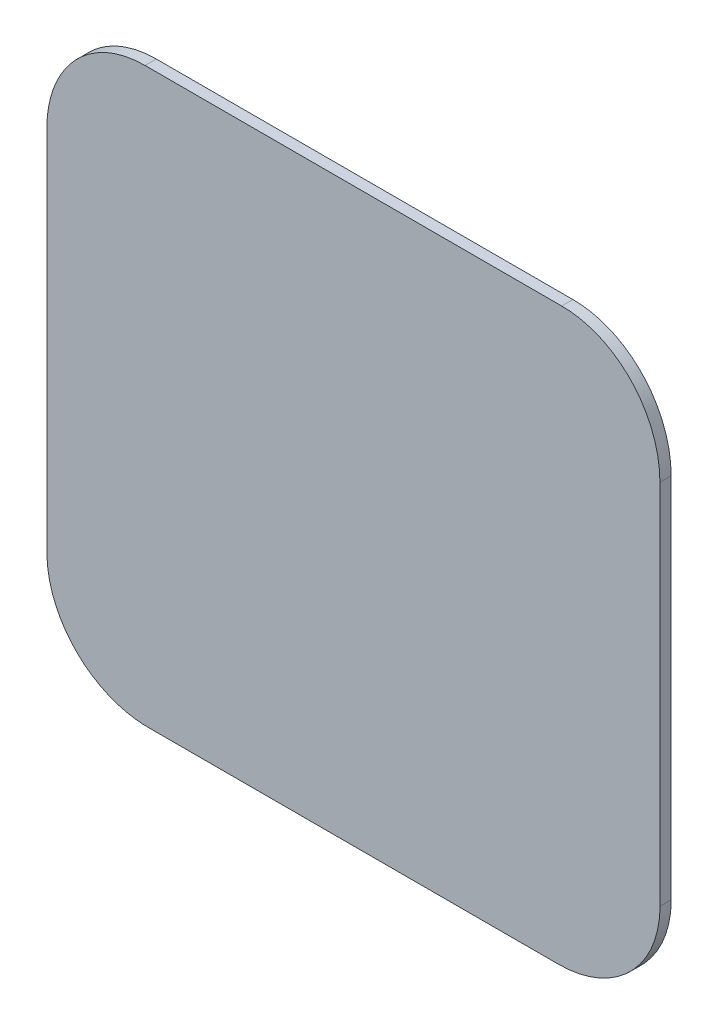
ISO-10303-21;
HEADER;
FILE_DESCRIPTION(('STEP AP214'),'2;1');
FILE_NAME('part.step','',(''),(''),'','','');
FILE_SCHEMA(('AUTOMOTIVE_DESIGN { 1 0 10303 214 1 1 1 1 }'));
ENDSEC;
DATA;
#1=APPLICATION_CONTEXT('core data for automotive mechanical design processes');
#2=APPLICATION_PROTOCOL_DEFINITION('international standard','automotive_design',2000,#1);
#3=PRODUCT_CONTEXT('',#1,'mechanical');
#4=PRODUCT('Part','Part','',(#3));
#5=PRODUCT_RELATED_PRODUCT_CATEGORY('part','',(#4));
#6=PRODUCT_DEFINITION_FORMATION('','',#4);
#7=PRODUCT_DEFINITION_CONTEXT('part definition',#1,'design');
#8=PRODUCT_DEFINITION('design','',#6,#7);
#9=PRODUCT_DEFINITION_SHAPE('','',#8);
#10=(LENGTH_UNIT() NAMED_UNIT(*) SI_UNIT(.MILLI.,.METRE.));
#11=(NAMED_UNIT(*) PLANE_ANGLE_UNIT() SI_UNIT($,.RADIAN.));
#12=(NAMED_UNIT(*) SI_UNIT($,.STERADIAN.) SOLID_ANGLE_UNIT());
#13=UNCERTAINTY_MEASURE_WITH_UNIT(LENGTH_MEASURE(1.E-05),#10,'distance_accuracy_value','');
#14=(GEOMETRIC_REPRESENTATION_CONTEXT(3) GLOBAL_UNCERTAINTY_ASSIGNED_CONTEXT((#13)) GLOBAL_UNIT_ASSIGNED_CONTEXT((#10,
#11,#12)) REPRESENTATION_CONTEXT('',''));
#15=CARTESIAN_POINT('',(0.,0.,0.));
#16=DIRECTION('',(0.,0.,1.));
#17=DIRECTION('',(1.,0.,0.));
#18=AXIS2_PLACEMENT_3D('',#15,#16,#17);
#19=CARTESIAN_POINT('',(0.,0.,0.));
#20=DIRECTION('',(0.,0.,1.));
#21=DIRECTION('',(1.,0.,0.));
#22=AXIS2_PLACEMENT_3D('',#19,#20,#21);
#23=PLANE('',#22);
#24=CARTESIAN_POINT('',(54.8517934249132,-69.4999999999831,0.));
#25=CARTESIAN_POINT('',(56.6388108832568,-69.4997280578014,0.));
#26=CARTESIAN_POINT('',(58.4061720486241,-69.325774200745,0.));
#27=CARTESIAN_POINT('',(60.5909824728886,-68.8928140691264,0.));
#28=CARTESIAN_POINT('',(61.0276747297744,-68.7950840004207,0.));
#29=CARTESIAN_POINT('',(61.891893773405,-68.5792790781047,0.));
#30=CARTESIAN_POINT('',(62.3197800835576,-68.4611893541635,0.));
#31=CARTESIAN_POINT('',(63.5909915880783,-68.0768944083276,0.));
#32=CARTESIAN_POINT('',(65.2528054281784,-67.484573056019,0.));
#33=CARTESIAN_POINT('',(66.8492448209406,-66.7345549725222,0.));
#34=CARTESIAN_POINT('',(68.0216894372309,-66.1120137996385,0.));
#35=CARTESIAN_POINT('',(68.408349501156,-65.8944778159742,0.));
#36=CARTESIAN_POINT('',(69.1732056736711,-65.4389890322341,0.));
#37=CARTESIAN_POINT('',(69.5521013256622,-65.2005129740823,0.));
#38=CARTESIAN_POINT('',(71.4054027174245,-63.9692708230625,0.));
#39=CARTESIAN_POINT('',(72.7713579934451,-62.8535442856898,0.));
#40=CARTESIAN_POINT('',(74.6492788603838,-60.988355506852,0.));
#41=CARTESIAN_POINT('',(75.2465474211922,-60.3344652539332,0.));
#42=CARTESIAN_POINT('',(76.0980017747353,-59.3038305491633,0.));
#43=CARTESIAN_POINT('',(76.3743231809448,-58.9519310725792,0.));
#44=CARTESIAN_POINT('',(76.9059631291518,-58.2393096697751,0.));
#45=CARTESIAN_POINT('',(77.1620962956989,-57.8776330105433,0.));
#46=CARTESIAN_POINT('',(78.3950847146277,-56.0428390532415,0.));
#47=CARTESIAN_POINT('',(79.2302720515857,-54.4912455331984,0.));
#48=CARTESIAN_POINT('',(80.2540712697688,-52.0370119554778,0.));
#49=CARTESIAN_POINT('',(80.5580464385872,-51.1930237782792,0.));
#50=CARTESIAN_POINT('',(81.0761099787239,-49.494011536393,0.));
#51=CARTESIAN_POINT('',(81.2915345655687,-48.6370791214738,0.));
#52=CARTESIAN_POINT('',(81.8099017172882,-46.0444994085925,0.));
#53=CARTESIAN_POINT('',(81.986203643792,-44.2872852370024,0.));
#54=CARTESIAN_POINT('',(81.9859283349487,-42.5,0.));
#55=B_SPLINE_CURVE_WITH_KNOTS('',3,(#24,#25,#26,#27,#28,#29,#30,#31,#32,#33,#34,#35,#36,#37,#38,
#39,#40,#41,#42,#43,#44,#45,#46,#47,#48,#49,#50,#51,#52,#53,#54),.UNSPECIFIED.,.F.,.F.,(4,2,2,2,
1,2,2,2,2,2,2,2,2,2,2,4),(0.,0.125,0.15625,0.1875,0.25,0.3125,0.343749999999999,
0.374999999999999,0.499999999999997,0.562499999999997,0.593749999999997,0.624999999999997,
0.749999999999998,0.812499999999999,0.874999999999999,1.),.UNSPECIFIED.);
#56=CARTESIAN_POINT('',(54.8517934249132,-69.4999999999831,0.));
#57=VERTEX_POINT('',#56);
#58=CARTESIAN_POINT('',(81.9859283349487,-42.5,0.));
#59=VERTEX_POINT('',#58);
#60=EDGE_CURVE('E64',#57,#59,#55,.T.);
#61=ORIENTED_EDGE('',*,*,#60,.F.);
#62=DIRECTION('',(1.,1.54471405046143E-13,0.));
#63=VECTOR('',#62,1.);
#64=CARTESIAN_POINT('',(-54.8434534609407,-69.5,0.));
#65=LINE('',#64,#63);
#66=CARTESIAN_POINT('',(-54.8434534608995,-69.4999999999999,0.));
#67=VERTEX_POINT('',#66);
#68=EDGE_CURVE('E175',#67,#57,#65,.T.);
#69=ORIENTED_EDGE('',*,*,#68,.F.);
#70=CARTESIAN_POINT('',(-81.9859283349463,-42.5000000000003,0.));
#71=CARTESIAN_POINT('',(-81.9859283349463,-44.2875586548453,0.));
#72=CARTESIAN_POINT('',(-81.8093285287145,-46.0450147697015,0.));
#73=CARTESIAN_POINT('',(-81.2904821009578,-48.6379121377191,0.));
#74=CARTESIAN_POINT('',(-81.0748923055708,-49.4949428379756,0.));
#75=CARTESIAN_POINT('',(-80.5564872002231,-51.1941361047317,0.));
#76=CARTESIAN_POINT('',(-80.2523351748746,-52.0382071099846,0.));
#77=CARTESIAN_POINT('',(-79.2280001270455,-54.4926602552935,0.));
#78=CARTESIAN_POINT('',(-78.3924450799638,-56.0443639854412,0.));
#79=CARTESIAN_POINT('',(-77.1589840350824,-57.879250924782,0.));
#80=CARTESIAN_POINT('',(-76.90275568807,-58.2409439211891,0.));
#81=CARTESIAN_POINT('',(-76.3709240475855,-58.9535934081718,0.));
#82=CARTESIAN_POINT('',(-76.0945058569742,-59.3055046538057,0.));
#83=CARTESIAN_POINT('',(-75.24276154672,-60.3361674090838,0.));
#84=CARTESIAN_POINT('',(-74.6453002310132,-60.990066774237,0.));
#85=CARTESIAN_POINT('',(-72.7668026965133,-62.8552550255656,0.));
#86=CARTESIAN_POINT('',(-71.4004650899005,-63.9709443217905,0.));
#87=CARTESIAN_POINT('',(-69.5466884900386,-65.2020927264623,0.));
#88=CARTESIAN_POINT('',(-69.1676977250982,-65.4405475930913,0.));
#89=CARTESIAN_POINT('',(-68.4026535449302,-65.895989635569,0.));
#90=CARTESIAN_POINT('',(-68.0159003979151,-66.1135000430588,0.));
#91=CARTESIAN_POINT('',(-66.8431792441962,-66.7359579914426,0.));
#92=CARTESIAN_POINT('',(-65.246378353698,-67.4858478168551,0.));
#93=CARTESIAN_POINT('',(-63.5842172391515,-68.0780068404427,0.));
#94=CARTESIAN_POINT('',(-62.3127506855681,-68.4621670882919,0.));
#95=CARTESIAN_POINT('',(-61.8847802617756,-68.5802097505317,0.));
#96=CARTESIAN_POINT('',(-61.0203948285239,-68.7959161474954,0.));
#97=CARTESIAN_POINT('',(-60.5836202379774,-68.8935947001051,0.));
#98=CARTESIAN_POINT('',(-58.3984065172446,-69.3262885277581,0.));
#99=CARTESIAN_POINT('',(-56.6307462708748,-69.5000000000028,0.));
#100=CARTESIAN_POINT('',(-54.8434534608995,-69.4999999999999,0.));
#101=B_SPLINE_CURVE_WITH_KNOTS('',3,(#70,#71,#72,#73,#74,#75,#76,#77,#78,#79,#80,#81,#82,#83,
#84,#85,#86,#87,#88,#89,#90,#91,#92,#93,#94,#95,#96,#97,#98,#99,#100),.UNSPECIFIED.,.F.,.F.,(4,
2,2,2,2,2,2,2,2,2,2,1,2,2,2,4),(0.,0.125,0.1875,0.249999999999999,0.374999999999999,
0.406249999999999,0.437499999999999,0.499999999999998,0.624999999999999,0.656249999999999,
0.687499999999998,0.749999999999998,0.812499999999998,0.843749999999999,0.874999999999999,
1.00000000000102),.UNSPECIFIED.);
#102=CARTESIAN_POINT('',(-81.9859283349463,-42.5,0.));
#103=VERTEX_POINT('',#102);
#104=EDGE_CURVE('E177',#103,#67,#101,.T.);
#105=ORIENTED_EDGE('',*,*,#104,.F.);
#106=DIRECTION('',(0.,-1.,0.));
#107=VECTOR('',#106,1.);
#108=CARTESIAN_POINT('',(-81.9859283349463,-42.5,0.));
#109=LINE('',#108,#107);
#110=CARTESIAN_POINT('',(-81.9859283349464,55.6964256632348,0.));
#111=VERTEX_POINT('',#110);
#112=EDGE_CURVE('E131',#111,#103,#109,.T.);
#113=ORIENTED_EDGE('',*,*,#112,.F.);
#114=CARTESIAN_POINT('',(-55.7121131283037,83.4001373511269,0.));
#115=CARTESIAN_POINT('',(-56.6057095987472,83.4001373511269,0.));
#116=CARTESIAN_POINT('',(-57.4951973633846,83.3536793854252,0.));
#117=CARTESIAN_POINT('',(-58.8232905787997,83.2145839526618,0.));
#118=CARTESIAN_POINT('',(-59.2649633734138,83.1566295613698,0.));
#119=CARTESIAN_POINT('',(-60.1462404125079,83.0173312649762,0.));
#120=CARTESIAN_POINT('',(-60.5860906459748,82.935871053068,0.));
#121=CARTESIAN_POINT('',(-62.7600699303676,82.4740178150794,0.));
#122=CARTESIAN_POINT('',(-64.4351755351361,81.9293835842275,0.));
#123=CARTESIAN_POINT('',(-66.8542020207876,80.8564968152442,0.));
#124=CARTESIAN_POINT('',(-67.6448259858651,80.4559034493622,0.));
#125=CARTESIAN_POINT('',(-69.1936595764453,79.5661146941881,0.));
#126=CARTESIAN_POINT('',(-69.9388849477529,79.084287146529,0.));
#127=CARTESIAN_POINT('',(-72.0848748182152,77.5371978948764,0.));
#128=CARTESIAN_POINT('',(-73.3996502634675,76.3695572282232,0.));
#129=CARTESIAN_POINT('',(-75.2005450538834,74.4167323571299,0.));
#130=CARTESIAN_POINT('',(-75.774816372496,73.7279064063154,0.));
#131=CARTESIAN_POINT('',(-76.8422536771371,72.3108700186526,0.));
#132=CARTESIAN_POINT('',(-77.3376516418845,71.5809829240849,0.));
#133=CARTESIAN_POINT('',(-78.7137592792608,69.32993385106,0.));
#134=CARTESIAN_POINT('',(-79.4853111656902,67.7479018296674,0.));
#135=CARTESIAN_POINT('',(-80.2683418230746,65.6692019478484,0.));
#136=CARTESIAN_POINT('',(-80.4161204825924,65.2472851759925,0.));
#137=CARTESIAN_POINT('',(-80.6906570507844,64.4010052005841,0.));
#138=CARTESIAN_POINT('',(-80.8176594239647,63.9761535383021,0.));
#139=CARTESIAN_POINT('',(-81.1686552131574,62.6965946476008,0.));
#140=CARTESIAN_POINT('',(-81.3627030188046,61.8368944730706,0.));
#141=CARTESIAN_POINT('',(-81.8287011760895,59.2384286062646,0.));
#142=CARTESIAN_POINT('',(-81.9859283349464,57.480534677421,0.));
#143=CARTESIAN_POINT('',(-81.9859283349464,55.6964256632348,0.));
#144=B_SPLINE_CURVE_WITH_KNOTS('',3,(#114,#115,#116,#117,#118,#119,#120,#121,#122,#123,#124,
#125,#126,#127,#128,#129,#130,#131,#132,#133,#134,#135,#136,#137,#138,#139,#140,#141,#142,#143),
.UNSPECIFIED.,.F.,.F.,(4,2,2,2,2,2,2,2,2,2,2,2,2,2,4),(0.,0.0624999999999997,0.0937499999999996,
0.124999999999999,0.249999999999998,0.312499999999998,0.374999999999997,0.499999999999997,
0.562499999999996,0.624999999999996,0.749999999999995,0.781249999999995,0.812499999999996,
0.874999999999997,1.),.UNSPECIFIED.);
#145=CARTESIAN_POINT('',(-55.7121131283037,83.4001373511269,0.));
#146=VERTEX_POINT('',#145);
#147=EDGE_CURVE('E129',#146,#111,#144,.T.);
#148=ORIENTED_EDGE('',*,*,#147,.F.);
#149=DIRECTION('',(-1.,0.,0.));
#150=VECTOR('',#149,1.);
#151=CARTESIAN_POINT('',(55.7121131283033,83.4001373511269,0.));
#152=LINE('',#151,#150);
#153=CARTESIAN_POINT('',(55.7121131283033,83.4001373511269,0.));
#154=VERTEX_POINT('',#153);
#155=EDGE_CURVE('E112',#154,#146,#152,.T.);
#156=ORIENTED_EDGE('',*,*,#155,.F.);
#157=CARTESIAN_POINT('',(81.9859283349465,55.6964256632285,0.));
#158=CARTESIAN_POINT('',(81.9859283349468,57.479281480154,0.));
#159=CARTESIAN_POINT('',(81.8289191459647,59.2420445258293,0.));
#160=CARTESIAN_POINT('',(81.3588082412133,61.856167244492,0.));
#161=CARTESIAN_POINT('',(81.1619320339642,62.7250167267849,0.));
#162=CARTESIAN_POINT('',(80.6891064104784,64.4407276987603,0.));
#163=CARTESIAN_POINT('',(80.4149521216488,65.2820294331008,0.));
#164=CARTESIAN_POINT('',(79.4804072532398,67.7567744609749,0.));
#165=CARTESIAN_POINT('',(78.7090056134243,69.3415273040257,0.));
#166=CARTESIAN_POINT('',(77.5478680279263,71.2361125892539,0.));
#167=CARTESIAN_POINT('',(77.3051830304753,71.611369777183,0.));
#168=CARTESIAN_POINT('',(76.80443752642,72.3456529842663,0.));
#169=CARTESIAN_POINT('',(76.5459457355427,72.7054626737988,0.));
#170=CARTESIAN_POINT('',(75.7463008651528,73.7630654298869,0.));
#171=CARTESIAN_POINT('',(74.6157632297356,75.1150960333358,0.));
#172=CARTESIAN_POINT('',(73.3558826654361,76.3503232503456,0.));
#173=CARTESIAN_POINT('',(72.0291536136831,77.5251828092208,0.));
#174=CARTESIAN_POINT('',(71.3289046514158,78.0844634371537,0.));
#175=CARTESIAN_POINT('',(69.1693385056001,79.6343070866876,0.));
#176=CARTESIAN_POINT('',(67.6417872529491,80.5090113641237,0.));
#177=CARTESIAN_POINT('',(65.6216814381014,81.4026725726852,0.));
#178=CARTESIAN_POINT('',(65.212077414475,81.5713294834693,0.));
#179=CARTESIAN_POINT('',(64.3814759504028,81.8880817234552,0.));
#180=CARTESIAN_POINT('',(63.9594787864092,82.036446244729,0.));
#181=CARTESIAN_POINT('',(62.6902285928484,82.4455356462039,0.));
#182=CARTESIAN_POINT('',(61.8361792776292,82.671928723274,0.));
#183=CARTESIAN_POINT('',(59.2510609909953,83.216089045299,0.));
#184=CARTESIAN_POINT('',(57.4972428384082,83.4001373511269,0.));
#185=CARTESIAN_POINT('',(55.7121131283033,83.4001373511269,0.));
#186=B_SPLINE_CURVE_WITH_KNOTS('',3,(#157,#158,#159,#160,#161,#162,#163,#164,#165,#166,#167,
#168,#169,#170,#171,#172,#173,#174,#175,#176,#177,#178,#179,#180,#181,#182,#183,#184,#185),
.UNSPECIFIED.,.F.,.F.,(4,2,2,2,2,2,2,1,2,2,2,2,2,2,4),(0.,0.124999999999997,0.187499999999996,
0.249999999999994,0.374999999999992,0.406249999999992,0.437499999999992,0.499999999999992,
0.562499999999993,0.624999999999993,0.749999999999994,0.781249999999994,0.812499999999994,
0.874999999999996,1.),.UNSPECIFIED.);
#187=CARTESIAN_POINT('',(81.9859283349465,55.6964256632285,0.));
#188=VERTEX_POINT('',#187);
#189=EDGE_CURVE('E121',#188,#154,#186,.T.);
#190=ORIENTED_EDGE('',*,*,#189,.F.);
#191=DIRECTION('',(0.,1.,0.));
#192=VECTOR('',#191,1.);
#193=CARTESIAN_POINT('',(81.9859283349465,55.6964256632285,0.));
#194=LINE('',#193,#192);
#195=EDGE_CURVE('E125',#59,#188,#194,.T.);
#196=ORIENTED_EDGE('',*,*,#195,.F.);
#197=EDGE_LOOP('',(#61,#69,#105,#113,#148,#156,#190,#196));
#198=FACE_BOUND('',#197,.T.);
#199=ADVANCED_FACE('F40',(#198),#23,.F.);
#200=DIRECTION('',(0.,0.,1.));
#201=VECTOR('',#200,1.);
#202=SURFACE_OF_LINEAR_EXTRUSION('',#55,#201);
#203=DIRECTION('',(0.,0.,1.));
#204=VECTOR('',#203,1.);
#205=CARTESIAN_POINT('',(54.8517934249132,-69.4999999999831,0.));
#206=LINE('',#205,#204);
#207=CARTESIAN_POINT('',(54.8517934249132,-69.4999999999831,3.));
#208=VERTEX_POINT('',#207);
#209=EDGE_CURVE('E186',#57,#208,#206,.T.);
#210=ORIENTED_EDGE('',*,*,#209,.F.);
#211=ORIENTED_EDGE('',*,*,#60,.T.);
#212=DIRECTION('',(0.,0.,1.));
#213=VECTOR('',#212,1.);
#214=CARTESIAN_POINT('',(81.9859283349487,-42.5,0.));
#215=LINE('',#214,#213);
#216=CARTESIAN_POINT('',(81.9859283349487,-42.5,3.));
#217=VERTEX_POINT('',#216);
#218=EDGE_CURVE('E171',#59,#217,#215,.T.);
#219=ORIENTED_EDGE('',*,*,#218,.T.);
#220=CARTESIAN_POINT('',(54.8517934249132,-69.4999999999831,3.));
#221=CARTESIAN_POINT('',(56.6388108832568,-69.4997280578014,3.));
#222=CARTESIAN_POINT('',(58.4061720486241,-69.325774200745,3.));
#223=CARTESIAN_POINT('',(60.5909824728886,-68.8928140691264,3.));
#224=CARTESIAN_POINT('',(61.0276747297744,-68.7950840004207,3.));
#225=CARTESIAN_POINT('',(61.891893773405,-68.5792790781047,3.));
#226=CARTESIAN_POINT('',(62.3197800835576,-68.4611893541635,3.));
#227=CARTESIAN_POINT('',(63.5909915880783,-68.0768944083276,3.));
#228=CARTESIAN_POINT('',(65.2528054281784,-67.484573056019,3.));
#229=CARTESIAN_POINT('',(66.8492448209406,-66.7345549725222,3.));
#230=CARTESIAN_POINT('',(68.0216894372309,-66.1120137996385,3.));
#231=CARTESIAN_POINT('',(68.408349501156,-65.8944778159742,3.));
#232=CARTESIAN_POINT('',(69.1732056736711,-65.4389890322341,3.));
#233=CARTESIAN_POINT('',(69.5521013256622,-65.2005129740823,3.));
#234=CARTESIAN_POINT('',(71.4054027174245,-63.9692708230625,3.));
#235=CARTESIAN_POINT('',(72.7713579934451,-62.8535442856898,3.));
#236=CARTESIAN_POINT('',(74.6492788603838,-60.988355506852,3.));
#237=CARTESIAN_POINT('',(75.2465474211922,-60.3344652539332,3.));
#238=CARTESIAN_POINT('',(76.0980017747353,-59.3038305491633,3.));
#239=CARTESIAN_POINT('',(76.3743231809448,-58.9519310725792,3.));
#240=CARTESIAN_POINT('',(76.9059631291518,-58.2393096697751,3.));
#241=CARTESIAN_POINT('',(77.1620962956989,-57.8776330105433,3.));
#242=CARTESIAN_POINT('',(78.3950847146277,-56.0428390532415,3.));
#243=CARTESIAN_POINT('',(79.2302720515857,-54.4912455331984,3.));
#244=CARTESIAN_POINT('',(80.2540712697688,-52.0370119554778,3.));
#245=CARTESIAN_POINT('',(80.5580464385872,-51.1930237782792,3.));
#246=CARTESIAN_POINT('',(81.0761099787239,-49.494011536393,3.));
#247=CARTESIAN_POINT('',(81.2915345655687,-48.6370791214738,3.));
#248=CARTESIAN_POINT('',(81.8099017172882,-46.0444994085925,3.));
#249=CARTESIAN_POINT('',(81.986203643792,-44.2872852370024,3.));
#250=CARTESIAN_POINT('',(81.9859283349487,-42.5,3.));
#251=B_SPLINE_CURVE_WITH_KNOTS('',3,(#220,#221,#222,#223,#224,#225,#226,#227,#228,#229,#230,
#231,#232,#233,#234,#235,#236,#237,#238,#239,#240,#241,#242,#243,#244,#245,#246,#247,#248,#249,
#250),.UNSPECIFIED.,.F.,.F.,(4,2,2,2,1,2,2,2,2,2,2,2,2,2,2,4),(0.,0.125,0.15625,0.1875,0.25,
0.3125,0.343749999999999,0.374999999999999,0.499999999999997,0.562499999999997,
0.593749999999997,0.624999999999997,0.749999999999998,0.812499999999999,0.874999999999999,1.),.UNSPECIFIED.);
#252=EDGE_CURVE('E12',#208,#217,#251,.T.);
#253=ORIENTED_EDGE('',*,*,#252,.F.);
#254=EDGE_LOOP('',(#210,#211,#219,#253));
#255=FACE_BOUND('',#254,.T.);
#256=ADVANCED_FACE('F161',(#255),#202,.T.);
#257=CARTESIAN_POINT('',(-54.8434534609407,-69.5,0.));
#258=DIRECTION('',(1.54471405046143E-13,-1.,0.));
#259=DIRECTION('',(1.,1.54471405046143E-13,0.));
#260=AXIS2_PLACEMENT_3D('',#257,#258,#259);
#261=PLANE('',#260);
#262=DIRECTION('',(0.,0.,1.));
#263=VECTOR('',#262,1.);
#264=CARTESIAN_POINT('',(-54.8434534608995,-69.4999999999999,0.));
#265=LINE('',#264,#263);
#266=CARTESIAN_POINT('',(-54.8434534608995,-69.4999999999999,3.));
#267=VERTEX_POINT('',#266);
#268=EDGE_CURVE('E189',#67,#267,#265,.T.);
#269=ORIENTED_EDGE('',*,*,#268,.F.);
#270=ORIENTED_EDGE('',*,*,#68,.T.);
#271=ORIENTED_EDGE('',*,*,#209,.T.);
#272=DIRECTION('',(1.,1.54471405046143E-13,0.));
#273=VECTOR('',#272,1.);
#274=CARTESIAN_POINT('',(1.07357626507057E-11,-69.4999999999916,3.));
#275=LINE('',#274,#273);
#276=EDGE_CURVE('E49',#267,#208,#275,.T.);
#277=ORIENTED_EDGE('',*,*,#276,.F.);
#278=EDGE_LOOP('',(#269,#270,#271,#277));
#279=FACE_BOUND('',#278,.T.);
#280=ADVANCED_FACE('F164',(#279),#261,.T.);
#281=DIRECTION('',(0.,0.,1.));
#282=VECTOR('',#281,1.);
#283=SURFACE_OF_LINEAR_EXTRUSION('',#101,#282);
#284=DIRECTION('',(0.,0.,1.));
#285=VECTOR('',#284,1.);
#286=CARTESIAN_POINT('',(-81.9859283349463,-42.5,0.));
#287=LINE('',#286,#285);
#288=CARTESIAN_POINT('',(-81.9859283349463,-42.5,3.));
#289=VERTEX_POINT('',#288);
#290=EDGE_CURVE('E192',#103,#289,#287,.T.);
#291=ORIENTED_EDGE('',*,*,#290,.F.);
#292=ORIENTED_EDGE('',*,*,#104,.T.);
#293=ORIENTED_EDGE('',*,*,#268,.T.);
#294=CARTESIAN_POINT('',(-81.9859283349463,-42.5000000000003,3.));
#295=CARTESIAN_POINT('',(-81.9859283349463,-44.2875586548453,3.));
#296=CARTESIAN_POINT('',(-81.8093285287145,-46.0450147697015,3.));
#297=CARTESIAN_POINT('',(-81.2904821009578,-48.6379121377191,3.));
#298=CARTESIAN_POINT('',(-81.0748923055708,-49.4949428379756,3.));
#299=CARTESIAN_POINT('',(-80.5564872002231,-51.1941361047317,3.));
#300=CARTESIAN_POINT('',(-80.2523351748746,-52.0382071099846,3.));
#301=CARTESIAN_POINT('',(-79.2280001270455,-54.4926602552935,3.));
#302=CARTESIAN_POINT('',(-78.3924450799638,-56.0443639854412,3.));
#303=CARTESIAN_POINT('',(-77.1589840350824,-57.879250924782,3.));
#304=CARTESIAN_POINT('',(-76.90275568807,-58.2409439211891,3.));
#305=CARTESIAN_POINT('',(-76.3709240475855,-58.9535934081718,3.));
#306=CARTESIAN_POINT('',(-76.0945058569742,-59.3055046538057,3.));
#307=CARTESIAN_POINT('',(-75.24276154672,-60.3361674090838,3.));
#308=CARTESIAN_POINT('',(-74.6453002310132,-60.990066774237,3.));
#309=CARTESIAN_POINT('',(-72.7668026965133,-62.8552550255656,3.));
#310=CARTESIAN_POINT('',(-71.4004650899005,-63.9709443217905,3.));
#311=CARTESIAN_POINT('',(-69.5466884900386,-65.2020927264623,3.));
#312=CARTESIAN_POINT('',(-69.1676977250982,-65.4405475930913,3.));
#313=CARTESIAN_POINT('',(-68.4026535449302,-65.895989635569,3.));
#314=CARTESIAN_POINT('',(-68.0159003979151,-66.1135000430588,3.));
#315=CARTESIAN_POINT('',(-66.8431792441962,-66.7359579914426,3.));
#316=CARTESIAN_POINT('',(-65.246378353698,-67.4858478168551,3.));
#317=CARTESIAN_POINT('',(-63.5842172391515,-68.0780068404427,3.));
#318=CARTESIAN_POINT('',(-62.3127506855681,-68.4621670882919,3.));
#319=CARTESIAN_POINT('',(-61.8847802617756,-68.5802097505317,3.));
#320=CARTESIAN_POINT('',(-61.0203948285239,-68.7959161474954,3.));
#321=CARTESIAN_POINT('',(-60.5836202379774,-68.8935947001051,3.));
#322=CARTESIAN_POINT('',(-58.3984065172446,-69.3262885277581,3.));
#323=CARTESIAN_POINT('',(-56.6307462708748,-69.5000000000028,3.));
#324=CARTESIAN_POINT('',(-54.8434534608995,-69.4999999999999,3.));
#325=B_SPLINE_CURVE_WITH_KNOTS('',3,(#294,#295,#296,#297,#298,#299,#300,#301,#302,#303,#304,
#305,#306,#307,#308,#309,#310,#311,#312,#313,#314,#315,#316,#317,#318,#319,#320,#321,#322,#323,
#324),.UNSPECIFIED.,.F.,.F.,(4,2,2,2,2,2,2,2,2,2,2,1,2,2,2,4),(0.,0.125,0.1875,
0.249999999999999,0.374999999999999,0.406249999999999,0.437499999999999,0.499999999999998,
0.624999999999999,0.656249999999999,0.687499999999998,0.749999999999998,0.812499999999998,
0.843749999999999,0.874999999999999,1.00000000000102),.UNSPECIFIED.);
#326=EDGE_CURVE('E221',#289,#267,#325,.T.);
#327=ORIENTED_EDGE('',*,*,#326,.F.);
#328=EDGE_LOOP('',(#291,#292,#293,#327));
#329=FACE_BOUND('',#328,.T.);
#330=ADVANCED_FACE('F231',(#329),#283,.T.);
#331=CARTESIAN_POINT('',(-81.9859283349463,-42.5,0.));
#332=DIRECTION('',(-1.,0.,0.));
#333=DIRECTION('',(0.,-1.,0.));
#334=AXIS2_PLACEMENT_3D('',#331,#332,#333);
#335=PLANE('',#334);
#336=DIRECTION('',(0.,0.,1.));
#337=VECTOR('',#336,1.);
#338=CARTESIAN_POINT('',(-81.9859283349464,55.6964256632348,0.));
#339=LINE('',#338,#337);
#340=CARTESIAN_POINT('',(-81.9859283349464,55.6964256632348,3.));
#341=VERTEX_POINT('',#340);
#342=EDGE_CURVE('E195',#111,#341,#339,.T.);
#343=ORIENTED_EDGE('',*,*,#342,.F.);
#344=ORIENTED_EDGE('',*,*,#112,.T.);
#345=ORIENTED_EDGE('',*,*,#290,.T.);
#346=DIRECTION('',(0.,-1.,0.));
#347=VECTOR('',#346,1.);
#348=CARTESIAN_POINT('',(-81.9859283349463,0.,3.));
#349=LINE('',#348,#347);
#350=EDGE_CURVE('E215',#341,#289,#349,.T.);
#351=ORIENTED_EDGE('',*,*,#350,.F.);
#352=EDGE_LOOP('',(#343,#344,#345,#351));
#353=FACE_BOUND('',#352,.T.);
#354=ADVANCED_FACE('F150',(#353),#335,.T.);
#355=DIRECTION('',(0.,0.,1.));
#356=VECTOR('',#355,1.);
#357=SURFACE_OF_LINEAR_EXTRUSION('',#144,#356);
#358=DIRECTION('',(0.,0.,1.));
#359=VECTOR('',#358,1.);
#360=CARTESIAN_POINT('',(-55.7121131283037,83.4001373511269,0.));
#361=LINE('',#360,#359);
#362=CARTESIAN_POINT('',(-55.7121131283037,83.4001373511269,3.));
#363=VERTEX_POINT('',#362);
#364=EDGE_CURVE('E118',#146,#363,#361,.T.);
#365=ORIENTED_EDGE('',*,*,#364,.F.);
#366=ORIENTED_EDGE('',*,*,#147,.T.);
#367=ORIENTED_EDGE('',*,*,#342,.T.);
#368=CARTESIAN_POINT('',(-55.7121131283037,83.4001373511269,3.));
#369=CARTESIAN_POINT('',(-56.6057095987472,83.4001373511269,3.));
#370=CARTESIAN_POINT('',(-57.4951973633846,83.3536793854252,3.));
#371=CARTESIAN_POINT('',(-58.8232905787997,83.2145839526618,3.));
#372=CARTESIAN_POINT('',(-59.2649633734138,83.1566295613698,3.));
#373=CARTESIAN_POINT('',(-60.1462404125079,83.0173312649762,3.));
#374=CARTESIAN_POINT('',(-60.5860906459748,82.935871053068,3.));
#375=CARTESIAN_POINT('',(-62.7600699303676,82.4740178150794,3.));
#376=CARTESIAN_POINT('',(-64.4351755351361,81.9293835842275,3.));
#377=CARTESIAN_POINT('',(-66.8542020207876,80.8564968152442,3.));
#378=CARTESIAN_POINT('',(-67.6448259858651,80.4559034493622,3.));
#379=CARTESIAN_POINT('',(-69.1936595764453,79.5661146941881,3.));
#380=CARTESIAN_POINT('',(-69.9388849477529,79.084287146529,3.));
#381=CARTESIAN_POINT('',(-72.0848748182152,77.5371978948764,3.));
#382=CARTESIAN_POINT('',(-73.3996502634675,76.3695572282232,3.));
#383=CARTESIAN_POINT('',(-75.2005450538834,74.4167323571299,3.));
#384=CARTESIAN_POINT('',(-75.774816372496,73.7279064063154,3.));
#385=CARTESIAN_POINT('',(-76.8422536771371,72.3108700186526,3.));
#386=CARTESIAN_POINT('',(-77.3376516418845,71.5809829240849,3.));
#387=CARTESIAN_POINT('',(-78.7137592792608,69.32993385106,3.));
#388=CARTESIAN_POINT('',(-79.4853111656902,67.7479018296674,3.));
#389=CARTESIAN_POINT('',(-80.2683418230746,65.6692019478484,3.));
#390=CARTESIAN_POINT('',(-80.4161204825924,65.2472851759925,3.));
#391=CARTESIAN_POINT('',(-80.6906570507844,64.4010052005841,3.));
#392=CARTESIAN_POINT('',(-80.8176594239647,63.9761535383021,3.));
#393=CARTESIAN_POINT('',(-81.1686552131574,62.6965946476008,3.));
#394=CARTESIAN_POINT('',(-81.3627030188046,61.8368944730706,3.));
#395=CARTESIAN_POINT('',(-81.8287011760895,59.2384286062646,3.));
#396=CARTESIAN_POINT('',(-81.9859283349464,57.480534677421,3.));
#397=CARTESIAN_POINT('',(-81.9859283349464,55.6964256632348,3.));
#398=B_SPLINE_CURVE_WITH_KNOTS('',3,(#368,#369,#370,#371,#372,#373,#374,#375,#376,#377,#378,
#379,#380,#381,#382,#383,#384,#385,#386,#387,#388,#389,#390,#391,#392,#393,#394,#395,#396,#397),
.UNSPECIFIED.,.F.,.F.,(4,2,2,2,2,2,2,2,2,2,2,2,2,2,4),(0.,0.0624999999999997,0.0937499999999996,
0.124999999999999,0.249999999999998,0.312499999999998,0.374999999999997,0.499999999999997,
0.562499999999996,0.624999999999996,0.749999999999995,0.781249999999995,0.812499999999996,
0.874999999999997,1.),.UNSPECIFIED.);
#399=EDGE_CURVE('E210',#363,#341,#398,.T.);
#400=ORIENTED_EDGE('',*,*,#399,.F.);
#401=EDGE_LOOP('',(#365,#366,#367,#400));
#402=FACE_BOUND('',#401,.T.);
#403=ADVANCED_FACE('F146',(#402),#357,.T.);
#404=CARTESIAN_POINT('',(55.7121131283033,83.4001373511269,0.));
#405=DIRECTION('',(0.,1.,0.));
#406=DIRECTION('',(-1.,0.,0.));
#407=AXIS2_PLACEMENT_3D('',#404,#405,#406);
#408=PLANE('',#407);
#409=DIRECTION('',(0.,0.,1.));
#410=VECTOR('',#409,1.);
#411=CARTESIAN_POINT('',(55.7121131283033,83.4001373511269,0.));
#412=LINE('',#411,#410);
#413=CARTESIAN_POINT('',(55.7121131283033,83.4001373511269,3.));
#414=VERTEX_POINT('',#413);
#415=EDGE_CURVE('E107',#154,#414,#412,.T.);
#416=ORIENTED_EDGE('',*,*,#415,.F.);
#417=ORIENTED_EDGE('',*,*,#155,.T.);
#418=ORIENTED_EDGE('',*,*,#364,.T.);
#419=DIRECTION('',(-1.,0.,0.));
#420=VECTOR('',#419,1.);
#421=CARTESIAN_POINT('',(0.,83.4001373511269,3.));
#422=LINE('',#421,#420);
#423=EDGE_CURVE('E115',#414,#363,#422,.T.);
#424=ORIENTED_EDGE('',*,*,#423,.F.);
#425=EDGE_LOOP('',(#416,#417,#418,#424));
#426=FACE_BOUND('',#425,.T.);
#427=ADVANCED_FACE('F109',(#426),#408,.T.);
#428=DIRECTION('',(0.,0.,1.));
#429=VECTOR('',#428,1.);
#430=SURFACE_OF_LINEAR_EXTRUSION('',#186,#429);
#431=DIRECTION('',(0.,0.,1.));
#432=VECTOR('',#431,1.);
#433=CARTESIAN_POINT('',(81.9859283349465,55.6964256632285,0.));
#434=LINE('',#433,#432);
#435=CARTESIAN_POINT('',(81.9859283349465,55.6964256632285,3.));
#436=VERTEX_POINT('',#435);
#437=EDGE_CURVE('E56',#188,#436,#434,.T.);
#438=ORIENTED_EDGE('',*,*,#437,.F.);
#439=ORIENTED_EDGE('',*,*,#189,.T.);
#440=ORIENTED_EDGE('',*,*,#415,.T.);
#441=CARTESIAN_POINT('',(81.9859283349465,55.6964256632285,3.));
#442=CARTESIAN_POINT('',(81.9859283349468,57.479281480154,3.));
#443=CARTESIAN_POINT('',(81.8289191459647,59.2420445258293,3.));
#444=CARTESIAN_POINT('',(81.3588082412133,61.856167244492,3.));
#445=CARTESIAN_POINT('',(81.1619320339642,62.7250167267849,3.));
#446=CARTESIAN_POINT('',(80.6891064104784,64.4407276987603,3.));
#447=CARTESIAN_POINT('',(80.4149521216488,65.2820294331008,3.));
#448=CARTESIAN_POINT('',(79.4804072532398,67.7567744609749,3.));
#449=CARTESIAN_POINT('',(78.7090056134243,69.3415273040257,3.));
#450=CARTESIAN_POINT('',(77.5478680279263,71.2361125892539,3.));
#451=CARTESIAN_POINT('',(77.3051830304753,71.611369777183,3.));
#452=CARTESIAN_POINT('',(76.80443752642,72.3456529842663,3.));
#453=CARTESIAN_POINT('',(76.5459457355427,72.7054626737988,3.));
#454=CARTESIAN_POINT('',(75.7463008651528,73.7630654298869,3.));
#455=CARTESIAN_POINT('',(74.6157632297356,75.1150960333358,3.));
#456=CARTESIAN_POINT('',(73.3558826654361,76.3503232503456,3.));
#457=CARTESIAN_POINT('',(72.0291536136831,77.5251828092208,3.));
#458=CARTESIAN_POINT('',(71.3289046514158,78.0844634371537,3.));
#459=CARTESIAN_POINT('',(69.1693385056001,79.6343070866876,3.));
#460=CARTESIAN_POINT('',(67.6417872529491,80.5090113641237,3.));
#461=CARTESIAN_POINT('',(65.6216814381014,81.4026725726852,3.));
#462=CARTESIAN_POINT('',(65.212077414475,81.5713294834693,3.));
#463=CARTESIAN_POINT('',(64.3814759504028,81.8880817234552,3.));
#464=CARTESIAN_POINT('',(63.9594787864092,82.036446244729,3.));
#465=CARTESIAN_POINT('',(62.6902285928484,82.4455356462039,3.));
#466=CARTESIAN_POINT('',(61.8361792776292,82.671928723274,3.));
#467=CARTESIAN_POINT('',(59.2510609909953,83.216089045299,3.));
#468=CARTESIAN_POINT('',(57.4972428384082,83.4001373511269,3.));
#469=CARTESIAN_POINT('',(55.7121131283033,83.4001373511269,3.));
#470=B_SPLINE_CURVE_WITH_KNOTS('',3,(#441,#442,#443,#444,#445,#446,#447,#448,#449,#450,#451,
#452,#453,#454,#455,#456,#457,#458,#459,#460,#461,#462,#463,#464,#465,#466,#467,#468,#469),
.UNSPECIFIED.,.F.,.F.,(4,2,2,2,2,2,2,1,2,2,2,2,2,2,4),(0.,0.124999999999997,0.187499999999996,
0.249999999999994,0.374999999999992,0.406249999999992,0.437499999999992,0.499999999999992,
0.562499999999993,0.624999999999993,0.749999999999994,0.781249999999994,0.812499999999994,
0.874999999999996,1.),.UNSPECIFIED.);
#471=EDGE_CURVE('E202',#436,#414,#470,.T.);
#472=ORIENTED_EDGE('',*,*,#471,.F.);
#473=EDGE_LOOP('',(#438,#439,#440,#472));
#474=FACE_BOUND('',#473,.T.);
#475=ADVANCED_FACE('F122',(#474),#430,.T.);
#476=CARTESIAN_POINT('',(81.9859283349465,55.6964256632285,0.));
#477=DIRECTION('',(1.,0.,0.));
#478=DIRECTION('',(0.,1.,0.));
#479=AXIS2_PLACEMENT_3D('',#476,#477,#478);
#480=PLANE('',#479);
#481=ORIENTED_EDGE('',*,*,#218,.F.);
#482=ORIENTED_EDGE('',*,*,#195,.T.);
#483=ORIENTED_EDGE('',*,*,#437,.T.);
#484=DIRECTION('',(0.,1.,0.));
#485=VECTOR('',#484,1.);
#486=CARTESIAN_POINT('',(81.9859283349477,1.7959555339314E-12,3.));
#487=LINE('',#486,#485);
#488=EDGE_CURVE('E188',#217,#436,#487,.T.);
#489=ORIENTED_EDGE('',*,*,#488,.F.);
#490=EDGE_LOOP('',(#481,#482,#483,#489));
#491=FACE_BOUND('',#490,.T.);
#492=ADVANCED_FACE('F157',(#491),#480,.T.);
#493=CARTESIAN_POINT('',(0.,0.,3.));
#494=DIRECTION('',(0.,0.,1.));
#495=DIRECTION('',(1.,0.,0.));
#496=AXIS2_PLACEMENT_3D('',#493,#494,#495);
#497=PLANE('',#496);
#498=ORIENTED_EDGE('',*,*,#276,.T.);
#499=ORIENTED_EDGE('',*,*,#252,.T.);
#500=ORIENTED_EDGE('',*,*,#488,.T.);
#501=ORIENTED_EDGE('',*,*,#471,.T.);
#502=ORIENTED_EDGE('',*,*,#423,.T.);
#503=ORIENTED_EDGE('',*,*,#399,.T.);
#504=ORIENTED_EDGE('',*,*,#350,.T.);
#505=ORIENTED_EDGE('',*,*,#326,.T.);
#506=EDGE_LOOP('',(#498,#499,#500,#501,#502,#503,#504,#505));
#507=FACE_BOUND('',#506,.T.);
#508=ADVANCED_FACE('F160',(#507),#497,.T.);
#509=CLOSED_SHELL('',(#199,#256,#280,#330,#354,#403,#427,#475,#492,#508));
#510=MANIFOLD_SOLID_BREP('B2',#509);
#511=ADVANCED_BREP_SHAPE_REPRESENTATION('',(#18,#510),#14);
#512=SHAPE_DEFINITION_REPRESENTATION(#9,#511);
ENDSEC;
END-ISO-10303-21;
